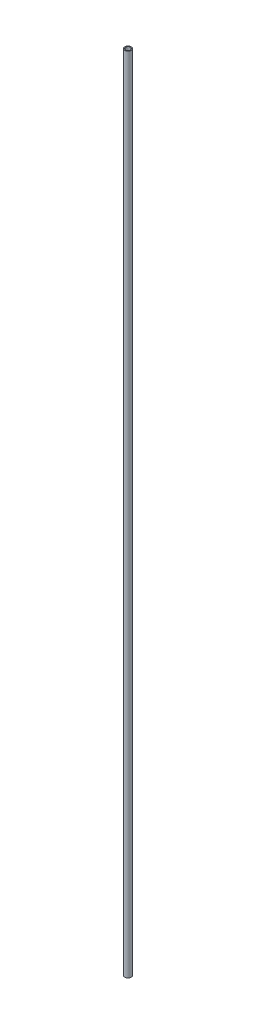
ISO-10303-21;
HEADER;
FILE_DESCRIPTION(('STEP AP214'),'2;1');
FILE_NAME('part.step','',(''),(''),'','','');
FILE_SCHEMA(('AUTOMOTIVE_DESIGN { 1 0 10303 214 1 1 1 1 }'));
ENDSEC;
DATA;
#1=APPLICATION_CONTEXT('core data for automotive mechanical design processes');
#2=APPLICATION_PROTOCOL_DEFINITION('international standard','automotive_design',2000,#1);
#3=PRODUCT_CONTEXT('',#1,'mechanical');
#4=PRODUCT('Part','Part','',(#3));
#5=PRODUCT_RELATED_PRODUCT_CATEGORY('part','',(#4));
#6=PRODUCT_DEFINITION_FORMATION('','',#4);
#7=PRODUCT_DEFINITION_CONTEXT('part definition',#1,'design');
#8=PRODUCT_DEFINITION('design','',#6,#7);
#9=PRODUCT_DEFINITION_SHAPE('','',#8);
#10=(LENGTH_UNIT() NAMED_UNIT(*) SI_UNIT(.MILLI.,.METRE.));
#11=(NAMED_UNIT(*) PLANE_ANGLE_UNIT() SI_UNIT($,.RADIAN.));
#12=(NAMED_UNIT(*) SI_UNIT($,.STERADIAN.) SOLID_ANGLE_UNIT());
#13=UNCERTAINTY_MEASURE_WITH_UNIT(LENGTH_MEASURE(1.E-05),#10,'distance_accuracy_value','');
#14=(GEOMETRIC_REPRESENTATION_CONTEXT(3) GLOBAL_UNCERTAINTY_ASSIGNED_CONTEXT((#13)) GLOBAL_UNIT_ASSIGNED_CONTEXT((#10,
#11,#12)) REPRESENTATION_CONTEXT('',''));
#15=CARTESIAN_POINT('',(0.,0.,0.));
#16=DIRECTION('',(0.,0.,1.));
#17=DIRECTION('',(1.,0.,0.));
#18=AXIS2_PLACEMENT_3D('',#15,#16,#17);
#19=CARTESIAN_POINT('',(0.,0.,0.));
#20=DIRECTION('',(0.,1.,0.));
#21=DIRECTION('',(0.,0.,1.));
#22=AXIS2_PLACEMENT_3D('',#19,#20,#21);
#23=CYLINDRICAL_SURFACE('',#22,4.);
#24=CARTESIAN_POINT('',(0.,1000.,0.));
#25=DIRECTION('',(0.,1.,0.));
#26=DIRECTION('',(0.,0.,1.));
#27=AXIS2_PLACEMENT_3D('',#24,#25,#26);
#28=CIRCLE('',#27,4.);
#29=CARTESIAN_POINT('',(0.,1000.,4.));
#30=VERTEX_POINT('',#29);
#31=EDGE_CURVE('E62',#30,#30,#28,.T.);
#32=ORIENTED_EDGE('',*,*,#31,.F.);
#33=EDGE_LOOP('',(#32));
#34=FACE_BOUND('',#33,.T.);
#35=CARTESIAN_POINT('',(0.,0.,0.));
#36=DIRECTION('',(0.,1.,0.));
#37=DIRECTION('',(0.,0.,1.));
#38=AXIS2_PLACEMENT_3D('',#35,#36,#37);
#39=CIRCLE('',#38,4.);
#40=CARTESIAN_POINT('',(0.,0.,4.));
#41=VERTEX_POINT('',#40);
#42=EDGE_CURVE('E47',#41,#41,#39,.T.);
#43=ORIENTED_EDGE('',*,*,#42,.T.);
#44=EDGE_LOOP('',(#43));
#45=FACE_BOUND('',#44,.T.);
#46=ADVANCED_FACE('F44',(#34,#45),#23,.T.);
#47=CARTESIAN_POINT('',(0.,0.,0.));
#48=DIRECTION('',(0.,1.,0.));
#49=DIRECTION('',(0.,0.,1.));
#50=AXIS2_PLACEMENT_3D('',#47,#48,#49);
#51=PLANE('',#50);
#52=CARTESIAN_POINT('',(0.,0.,0.));
#53=DIRECTION('',(0.,1.,0.));
#54=DIRECTION('',(0.,0.,1.));
#55=AXIS2_PLACEMENT_3D('',#52,#53,#54);
#56=CIRCLE('',#55,3.);
#57=CARTESIAN_POINT('',(0.,0.,3.));
#58=VERTEX_POINT('',#57);
#59=EDGE_CURVE('E52',#58,#58,#56,.F.);
#60=ORIENTED_EDGE('',*,*,#59,.F.);
#61=EDGE_LOOP('',(#60));
#62=FACE_BOUND('',#61,.T.);
#63=ORIENTED_EDGE('',*,*,#42,.F.);
#64=EDGE_LOOP('',(#63));
#65=FACE_BOUND('',#64,.T.);
#66=ADVANCED_FACE('F80',(#62,#65),#51,.F.);
#67=CARTESIAN_POINT('',(0.,1000.,0.));
#68=DIRECTION('',(0.,1.,0.));
#69=DIRECTION('',(0.,0.,1.));
#70=AXIS2_PLACEMENT_3D('',#67,#68,#69);
#71=PLANE('',#70);
#72=CARTESIAN_POINT('',(0.,1000.,0.));
#73=DIRECTION('',(0.,1.,0.));
#74=DIRECTION('',(0.,0.,1.));
#75=AXIS2_PLACEMENT_3D('',#72,#73,#74);
#76=CIRCLE('',#75,3.);
#77=CARTESIAN_POINT('',(0.,1000.,3.));
#78=VERTEX_POINT('',#77);
#79=EDGE_CURVE('E13',#78,#78,#76,.F.);
#80=ORIENTED_EDGE('',*,*,#79,.T.);
#81=EDGE_LOOP('',(#80));
#82=FACE_BOUND('',#81,.T.);
#83=ORIENTED_EDGE('',*,*,#31,.T.);
#84=EDGE_LOOP('',(#83));
#85=FACE_BOUND('',#84,.T.);
#86=ADVANCED_FACE('F69',(#82,#85),#71,.T.);
#87=CARTESIAN_POINT('',(0.,0.,0.));
#88=DIRECTION('',(0.,1.,0.));
#89=DIRECTION('',(0.,0.,1.));
#90=AXIS2_PLACEMENT_3D('',#87,#88,#89);
#91=CYLINDRICAL_SURFACE('',#90,3.);
#92=ORIENTED_EDGE('',*,*,#79,.F.);
#93=EDGE_LOOP('',(#92));
#94=FACE_BOUND('',#93,.T.);
#95=ORIENTED_EDGE('',*,*,#59,.T.);
#96=EDGE_LOOP('',(#95));
#97=FACE_BOUND('',#96,.T.);
#98=ADVANCED_FACE('F72',(#94,#97),#91,.F.);
#99=CLOSED_SHELL('',(#46,#66,#86,#98));
#100=MANIFOLD_SOLID_BREP('B2',#99);
#101=ADVANCED_BREP_SHAPE_REPRESENTATION('',(#18,#100),#14);
#102=SHAPE_DEFINITION_REPRESENTATION(#9,#101);
ENDSEC;
END-ISO-10303-21;
